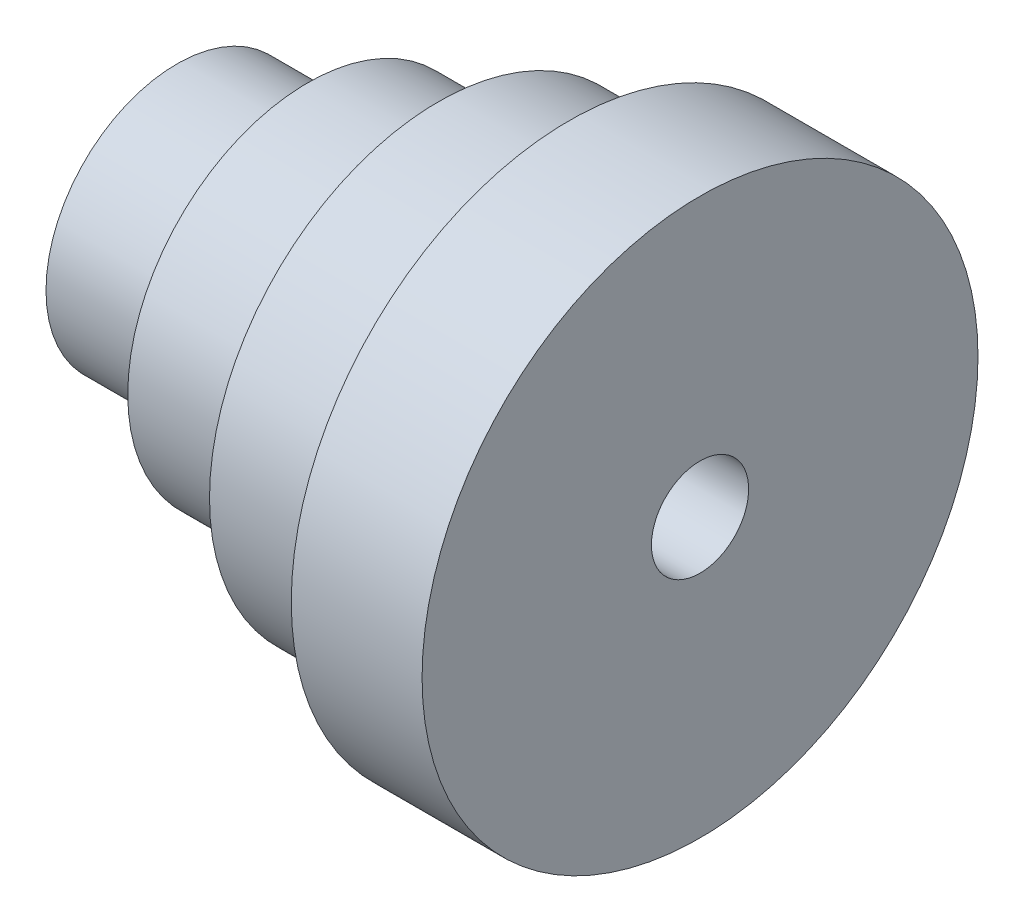
ISO-10303-21;
HEADER;
FILE_DESCRIPTION(('STEP AP214'),'2;1');
FILE_NAME('part.step','',(''),(''),'','','');
FILE_SCHEMA(('AUTOMOTIVE_DESIGN { 1 0 10303 214 1 1 1 1 }'));
ENDSEC;
DATA;
#1=APPLICATION_CONTEXT('core data for automotive mechanical design processes');
#2=APPLICATION_PROTOCOL_DEFINITION('international standard','automotive_design',2000,#1);
#3=PRODUCT_CONTEXT('',#1,'mechanical');
#4=PRODUCT('Part','Part','',(#3));
#5=PRODUCT_RELATED_PRODUCT_CATEGORY('part','',(#4));
#6=PRODUCT_DEFINITION_FORMATION('','',#4);
#7=PRODUCT_DEFINITION_CONTEXT('part definition',#1,'design');
#8=PRODUCT_DEFINITION('design','',#6,#7);
#9=PRODUCT_DEFINITION_SHAPE('','',#8);
#10=(LENGTH_UNIT() NAMED_UNIT(*) SI_UNIT(.MILLI.,.METRE.));
#11=(NAMED_UNIT(*) PLANE_ANGLE_UNIT() SI_UNIT($,.RADIAN.));
#12=(NAMED_UNIT(*) SI_UNIT($,.STERADIAN.) SOLID_ANGLE_UNIT());
#13=UNCERTAINTY_MEASURE_WITH_UNIT(LENGTH_MEASURE(1.E-05),#10,'distance_accuracy_value','');
#14=(GEOMETRIC_REPRESENTATION_CONTEXT(3) GLOBAL_UNCERTAINTY_ASSIGNED_CONTEXT((#13)) GLOBAL_UNIT_ASSIGNED_CONTEXT((#10,
#11,#12)) REPRESENTATION_CONTEXT('',''));
#15=CARTESIAN_POINT('',(0.,0.,0.));
#16=DIRECTION('',(0.,0.,1.));
#17=DIRECTION('',(1.,0.,0.));
#18=AXIS2_PLACEMENT_3D('',#15,#16,#17);
#19=CARTESIAN_POINT('',(-16.,0.,0.));
#20=DIRECTION('',(1.,0.,0.));
#21=DIRECTION('',(0.,0.,-1.));
#22=AXIS2_PLACEMENT_3D('',#19,#20,#21);
#23=PLANE('',#22);
#24=CARTESIAN_POINT('',(-16.,0.,0.));
#25=DIRECTION('',(-1.,0.,0.));
#26=DIRECTION('',(0.,0.,1.));
#27=AXIS2_PLACEMENT_3D('',#24,#25,#26);
#28=CIRCLE('',#27,14.8677131293198);
#29=CARTESIAN_POINT('',(-16.,0.,14.8677131293198));
#30=VERTEX_POINT('',#29);
#31=EDGE_CURVE('E97',#30,#30,#28,.T.);
#32=ORIENTED_EDGE('',*,*,#31,.T.);
#33=EDGE_LOOP('',(#32));
#34=FACE_BOUND('',#33,.T.);
#35=CARTESIAN_POINT('',(-16.,0.,0.));
#36=DIRECTION('',(-1.,0.,0.));
#37=DIRECTION('',(0.,0.,1.));
#38=AXIS2_PLACEMENT_3D('',#35,#36,#37);
#39=CIRCLE('',#38,85.);
#40=CARTESIAN_POINT('',(-16.,0.,85.));
#41=VERTEX_POINT('',#40);
#42=EDGE_CURVE('E125',#41,#41,#39,.T.);
#43=ORIENTED_EDGE('',*,*,#42,.F.);
#44=EDGE_LOOP('',(#43));
#45=FACE_BOUND('',#44,.T.);
#46=ADVANCED_FACE('F33',(#34,#45),#23,.T.);
#47=CARTESIAN_POINT('',(-176.,0.,0.));
#48=DIRECTION('',(-1.,0.,0.));
#49=DIRECTION('',(0.,0.,1.));
#50=AXIS2_PLACEMENT_3D('',#47,#48,#49);
#51=CYLINDRICAL_SURFACE('',#50,85.);
#52=ORIENTED_EDGE('',*,*,#42,.T.);
#53=EDGE_LOOP('',(#52));
#54=FACE_BOUND('',#53,.T.);
#55=CARTESIAN_POINT('',(-56.,0.,0.));
#56=DIRECTION('',(-1.,0.,0.));
#57=DIRECTION('',(0.,0.,1.));
#58=AXIS2_PLACEMENT_3D('',#55,#56,#57);
#59=CIRCLE('',#58,85.);
#60=CARTESIAN_POINT('',(-56.,0.,85.));
#61=VERTEX_POINT('',#60);
#62=EDGE_CURVE('E122',#61,#61,#59,.T.);
#63=ORIENTED_EDGE('',*,*,#62,.F.);
#64=EDGE_LOOP('',(#63));
#65=FACE_BOUND('',#64,.T.);
#66=ADVANCED_FACE('F147',(#54,#65),#51,.T.);
#67=CARTESIAN_POINT('',(-56.,0.,0.));
#68=DIRECTION('',(-1.,0.,0.));
#69=DIRECTION('',(0.,0.,1.));
#70=AXIS2_PLACEMENT_3D('',#67,#68,#69);
#71=PLANE('',#70);
#72=ORIENTED_EDGE('',*,*,#62,.T.);
#73=EDGE_LOOP('',(#72));
#74=FACE_BOUND('',#73,.T.);
#75=CARTESIAN_POINT('',(-56.,0.,0.));
#76=DIRECTION('',(-1.,0.,0.));
#77=DIRECTION('',(0.,0.,1.));
#78=AXIS2_PLACEMENT_3D('',#75,#76,#77);
#79=CIRCLE('',#78,70.);
#80=CARTESIAN_POINT('',(-56.,0.,70.));
#81=VERTEX_POINT('',#80);
#82=EDGE_CURVE('E119',#81,#81,#79,.T.);
#83=ORIENTED_EDGE('',*,*,#82,.F.);
#84=EDGE_LOOP('',(#83));
#85=FACE_BOUND('',#84,.T.);
#86=ADVANCED_FACE('F152',(#74,#85),#71,.T.);
#87=CARTESIAN_POINT('',(-176.,0.,0.));
#88=DIRECTION('',(-1.,0.,0.));
#89=DIRECTION('',(0.,0.,1.));
#90=AXIS2_PLACEMENT_3D('',#87,#88,#89);
#91=CYLINDRICAL_SURFACE('',#90,70.);
#92=ORIENTED_EDGE('',*,*,#82,.T.);
#93=EDGE_LOOP('',(#92));
#94=FACE_BOUND('',#93,.T.);
#95=CARTESIAN_POINT('',(-96.,0.,0.));
#96=DIRECTION('',(-1.,0.,0.));
#97=DIRECTION('',(0.,0.,1.));
#98=AXIS2_PLACEMENT_3D('',#95,#96,#97);
#99=CIRCLE('',#98,70.);
#100=CARTESIAN_POINT('',(-96.,0.,70.));
#101=VERTEX_POINT('',#100);
#102=EDGE_CURVE('E116',#101,#101,#99,.T.);
#103=ORIENTED_EDGE('',*,*,#102,.F.);
#104=EDGE_LOOP('',(#103));
#105=FACE_BOUND('',#104,.T.);
#106=ADVANCED_FACE('F162',(#94,#105),#91,.T.);
#107=CARTESIAN_POINT('',(-96.,0.,0.));
#108=DIRECTION('',(-1.,0.,0.));
#109=DIRECTION('',(0.,0.,1.));
#110=AXIS2_PLACEMENT_3D('',#107,#108,#109);
#111=PLANE('',#110);
#112=ORIENTED_EDGE('',*,*,#102,.T.);
#113=EDGE_LOOP('',(#112));
#114=FACE_BOUND('',#113,.T.);
#115=CARTESIAN_POINT('',(-96.,0.,0.));
#116=DIRECTION('',(-1.,0.,0.));
#117=DIRECTION('',(0.,0.,1.));
#118=AXIS2_PLACEMENT_3D('',#115,#116,#117);
#119=CIRCLE('',#118,55.);
#120=CARTESIAN_POINT('',(-96.,0.,55.));
#121=VERTEX_POINT('',#120);
#122=EDGE_CURVE('E113',#121,#121,#119,.T.);
#123=ORIENTED_EDGE('',*,*,#122,.F.);
#124=EDGE_LOOP('',(#123));
#125=FACE_BOUND('',#124,.T.);
#126=ADVANCED_FACE('F168',(#114,#125),#111,.T.);
#127=CARTESIAN_POINT('',(-176.,0.,0.));
#128=DIRECTION('',(-1.,0.,0.));
#129=DIRECTION('',(0.,0.,1.));
#130=AXIS2_PLACEMENT_3D('',#127,#128,#129);
#131=CYLINDRICAL_SURFACE('',#130,55.);
#132=ORIENTED_EDGE('',*,*,#122,.T.);
#133=EDGE_LOOP('',(#132));
#134=FACE_BOUND('',#133,.T.);
#135=CARTESIAN_POINT('',(-136.,0.,0.));
#136=DIRECTION('',(-1.,0.,0.));
#137=DIRECTION('',(0.,0.,1.));
#138=AXIS2_PLACEMENT_3D('',#135,#136,#137);
#139=CIRCLE('',#138,55.);
#140=CARTESIAN_POINT('',(-136.,0.,55.));
#141=VERTEX_POINT('',#140);
#142=EDGE_CURVE('E110',#141,#141,#139,.T.);
#143=ORIENTED_EDGE('',*,*,#142,.F.);
#144=EDGE_LOOP('',(#143));
#145=FACE_BOUND('',#144,.T.);
#146=ADVANCED_FACE('F174',(#134,#145),#131,.T.);
#147=CARTESIAN_POINT('',(-136.,0.,0.));
#148=DIRECTION('',(-1.,0.,0.));
#149=DIRECTION('',(0.,0.,1.));
#150=AXIS2_PLACEMENT_3D('',#147,#148,#149);
#151=PLANE('',#150);
#152=ORIENTED_EDGE('',*,*,#142,.T.);
#153=EDGE_LOOP('',(#152));
#154=FACE_BOUND('',#153,.T.);
#155=CARTESIAN_POINT('',(-136.,0.,0.));
#156=DIRECTION('',(-1.,0.,0.));
#157=DIRECTION('',(0.,0.,1.));
#158=AXIS2_PLACEMENT_3D('',#155,#156,#157);
#159=CIRCLE('',#158,40.);
#160=CARTESIAN_POINT('',(-136.,0.,40.));
#161=VERTEX_POINT('',#160);
#162=EDGE_CURVE('E107',#161,#161,#159,.T.);
#163=ORIENTED_EDGE('',*,*,#162,.F.);
#164=EDGE_LOOP('',(#163));
#165=FACE_BOUND('',#164,.T.);
#166=ADVANCED_FACE('F180',(#154,#165),#151,.T.);
#167=CARTESIAN_POINT('',(-176.,0.,0.));
#168=DIRECTION('',(-1.,0.,0.));
#169=DIRECTION('',(0.,0.,1.));
#170=AXIS2_PLACEMENT_3D('',#167,#168,#169);
#171=CYLINDRICAL_SURFACE('',#170,40.);
#172=ORIENTED_EDGE('',*,*,#162,.T.);
#173=EDGE_LOOP('',(#172));
#174=FACE_BOUND('',#173,.T.);
#175=CARTESIAN_POINT('',(-176.,0.,0.));
#176=DIRECTION('',(-1.,0.,0.));
#177=DIRECTION('',(0.,0.,1.));
#178=AXIS2_PLACEMENT_3D('',#175,#176,#177);
#179=CIRCLE('',#178,40.);
#180=CARTESIAN_POINT('',(-176.,0.,40.));
#181=VERTEX_POINT('',#180);
#182=EDGE_CURVE('E104',#181,#181,#179,.T.);
#183=ORIENTED_EDGE('',*,*,#182,.F.);
#184=EDGE_LOOP('',(#183));
#185=FACE_BOUND('',#184,.T.);
#186=ADVANCED_FACE('F186',(#174,#185),#171,.T.);
#187=CARTESIAN_POINT('',(-176.,0.,0.));
#188=DIRECTION('',(1.,0.,0.));
#189=DIRECTION('',(0.,0.,-1.));
#190=AXIS2_PLACEMENT_3D('',#187,#188,#189);
#191=PLANE('',#190);
#192=CARTESIAN_POINT('',(-176.,0.,0.));
#193=DIRECTION('',(-1.,0.,0.));
#194=DIRECTION('',(0.,0.,1.));
#195=AXIS2_PLACEMENT_3D('',#192,#193,#194);
#196=CIRCLE('',#195,14.8677131293198);
#197=CARTESIAN_POINT('',(-176.,-14.5618986981694,3.));
#198=VERTEX_POINT('',#197);
#199=CARTESIAN_POINT('',(-176.,-14.5618986981694,-3.));
#200=VERTEX_POINT('',#199);
#201=EDGE_CURVE('E101',#198,#200,#196,.T.);
#202=ORIENTED_EDGE('',*,*,#201,.F.);
#203=DIRECTION('',(0.,1.,0.));
#204=VECTOR('',#203,1.);
#205=CARTESIAN_POINT('',(-176.,-9.86771312931979,3.));
#206=LINE('',#205,#204);
#207=CARTESIAN_POINT('',(-176.,-19.8677131293198,3.));
#208=VERTEX_POINT('',#207);
#209=EDGE_CURVE('E92',#208,#198,#206,.T.);
#210=ORIENTED_EDGE('',*,*,#209,.F.);
#211=DIRECTION('',(0.,0.,1.));
#212=VECTOR('',#211,1.);
#213=CARTESIAN_POINT('',(-176.,-19.8677131293198,-3.));
#214=LINE('',#213,#212);
#215=CARTESIAN_POINT('',(-176.,-19.8677131293198,-3.));
#216=VERTEX_POINT('',#215);
#217=EDGE_CURVE('E95',#216,#208,#214,.T.);
#218=ORIENTED_EDGE('',*,*,#217,.F.);
#219=DIRECTION('',(0.,-1.,0.));
#220=VECTOR('',#219,1.);
#221=CARTESIAN_POINT('',(-176.,-9.86771312931979,-3.));
#222=LINE('',#221,#220);
#223=EDGE_CURVE('E82',#200,#216,#222,.T.);
#224=ORIENTED_EDGE('',*,*,#223,.F.);
#225=EDGE_LOOP('',(#202,#210,#218,#224));
#226=FACE_BOUND('',#225,.T.);
#227=ORIENTED_EDGE('',*,*,#182,.T.);
#228=EDGE_LOOP('',(#227));
#229=FACE_BOUND('',#228,.T.);
#230=ADVANCED_FACE('F132',(#226,#229),#191,.F.);
#231=CARTESIAN_POINT('',(-176.,0.,0.));
#232=DIRECTION('',(-1.,0.,0.));
#233=DIRECTION('',(0.,0.,1.));
#234=AXIS2_PLACEMENT_3D('',#231,#232,#233);
#235=CYLINDRICAL_SURFACE('',#234,14.8677131293198);
#236=ORIENTED_EDGE('',*,*,#31,.F.);
#237=EDGE_LOOP('',(#236));
#238=FACE_BOUND('',#237,.T.);
#239=CARTESIAN_POINT('',(-76.,0.,0.));
#240=DIRECTION('',(-1.,0.,0.));
#241=DIRECTION('',(0.,0.,1.));
#242=AXIS2_PLACEMENT_3D('',#239,#240,#241);
#243=CIRCLE('',#242,14.8677131293198);
#244=CARTESIAN_POINT('',(-76.,-14.5618986981694,3.));
#245=VERTEX_POINT('',#244);
#246=CARTESIAN_POINT('',(-76.,-14.5618986981694,-3.));
#247=VERTEX_POINT('',#246);
#248=EDGE_CURVE('E52',#245,#247,#243,.F.);
#249=ORIENTED_EDGE('',*,*,#248,.F.);
#250=DIRECTION('',(-1.,0.,0.));
#251=VECTOR('',#250,1.);
#252=CARTESIAN_POINT('',(-176.,-14.5618986981694,3.));
#253=LINE('',#252,#251);
#254=EDGE_CURVE('E11',#245,#198,#253,.T.);
#255=ORIENTED_EDGE('',*,*,#254,.T.);
#256=ORIENTED_EDGE('',*,*,#201,.T.);
#257=DIRECTION('',(-1.,0.,0.));
#258=VECTOR('',#257,1.);
#259=CARTESIAN_POINT('',(-176.,-14.5618986981694,-3.));
#260=LINE('',#259,#258);
#261=EDGE_CURVE('E40',#200,#247,#260,.F.);
#262=ORIENTED_EDGE('',*,*,#261,.T.);
#263=EDGE_LOOP('',(#249,#255,#256,#262));
#264=FACE_BOUND('',#263,.T.);
#265=ADVANCED_FACE('F129',(#238,#264),#235,.F.);
#266=CARTESIAN_POINT('',(-76.,-9.86771312931979,3.));
#267=DIRECTION('',(0.,0.,1.));
#268=DIRECTION('',(0.,-1.,0.));
#269=AXIS2_PLACEMENT_3D('',#266,#267,#268);
#270=PLANE('',#269);
#271=DIRECTION('',(0.,1.,0.));
#272=VECTOR('',#271,1.);
#273=CARTESIAN_POINT('',(-76.,-9.86771312931979,3.));
#274=LINE('',#273,#272);
#275=CARTESIAN_POINT('',(-76.,-19.8677131293198,3.));
#276=VERTEX_POINT('',#275);
#277=EDGE_CURVE('E47',#276,#245,#274,.T.);
#278=ORIENTED_EDGE('',*,*,#277,.F.);
#279=DIRECTION('',(-1.,0.,0.));
#280=VECTOR('',#279,1.);
#281=CARTESIAN_POINT('',(-76.,-19.8677131293198,3.));
#282=LINE('',#281,#280);
#283=EDGE_CURVE('E86',#276,#208,#282,.T.);
#284=ORIENTED_EDGE('',*,*,#283,.T.);
#285=ORIENTED_EDGE('',*,*,#209,.T.);
#286=ORIENTED_EDGE('',*,*,#254,.F.);
#287=EDGE_LOOP('',(#278,#284,#285,#286));
#288=FACE_BOUND('',#287,.T.);
#289=ADVANCED_FACE('F136',(#288),#270,.F.);
#290=CARTESIAN_POINT('',(-76.,-9.86771312931979,-3.));
#291=DIRECTION('',(0.,0.,-1.));
#292=DIRECTION('',(0.,1.,0.));
#293=AXIS2_PLACEMENT_3D('',#290,#291,#292);
#294=PLANE('',#293);
#295=ORIENTED_EDGE('',*,*,#223,.T.);
#296=DIRECTION('',(-1.,0.,0.));
#297=VECTOR('',#296,1.);
#298=CARTESIAN_POINT('',(-76.,-19.8677131293198,-3.));
#299=LINE('',#298,#297);
#300=CARTESIAN_POINT('',(-76.,-19.8677131293198,-3.));
#301=VERTEX_POINT('',#300);
#302=EDGE_CURVE('E79',#301,#216,#299,.T.);
#303=ORIENTED_EDGE('',*,*,#302,.F.);
#304=DIRECTION('',(0.,-1.,0.));
#305=VECTOR('',#304,1.);
#306=CARTESIAN_POINT('',(-76.,-9.86771312931979,-3.));
#307=LINE('',#306,#305);
#308=EDGE_CURVE('E70',#247,#301,#307,.T.);
#309=ORIENTED_EDGE('',*,*,#308,.F.);
#310=ORIENTED_EDGE('',*,*,#261,.F.);
#311=EDGE_LOOP('',(#295,#303,#309,#310));
#312=FACE_BOUND('',#311,.T.);
#313=ADVANCED_FACE('F80',(#312),#294,.F.);
#314=CARTESIAN_POINT('',(-76.,0.,0.));
#315=DIRECTION('',(-1.,0.,0.));
#316=DIRECTION('',(0.,0.,1.));
#317=AXIS2_PLACEMENT_3D('',#314,#315,#316);
#318=PLANE('',#317);
#319=ORIENTED_EDGE('',*,*,#248,.T.);
#320=ORIENTED_EDGE('',*,*,#308,.T.);
#321=DIRECTION('',(0.,0.,1.));
#322=VECTOR('',#321,1.);
#323=CARTESIAN_POINT('',(-76.,-19.8677131293198,-3.));
#324=LINE('',#323,#322);
#325=EDGE_CURVE('E74',#301,#276,#324,.T.);
#326=ORIENTED_EDGE('',*,*,#325,.T.);
#327=ORIENTED_EDGE('',*,*,#277,.T.);
#328=EDGE_LOOP('',(#319,#320,#326,#327));
#329=FACE_BOUND('',#328,.T.);
#330=ADVANCED_FACE('F72',(#329),#318,.T.);
#331=CARTESIAN_POINT('',(-76.,-19.8677131293198,-3.));
#332=DIRECTION('',(0.,-1.,0.));
#333=DIRECTION('',(0.,0.,-1.));
#334=AXIS2_PLACEMENT_3D('',#331,#332,#333);
#335=PLANE('',#334);
#336=ORIENTED_EDGE('',*,*,#217,.T.);
#337=ORIENTED_EDGE('',*,*,#283,.F.);
#338=ORIENTED_EDGE('',*,*,#325,.F.);
#339=ORIENTED_EDGE('',*,*,#302,.T.);
#340=EDGE_LOOP('',(#336,#337,#338,#339));
#341=FACE_BOUND('',#340,.T.);
#342=ADVANCED_FACE('F88',(#341),#335,.F.);
#343=CLOSED_SHELL('',(#46,#66,#86,#106,#126,#146,#166,#186,#230,#265,#289,#313,#330,#342));
#344=MANIFOLD_SOLID_BREP('B2',#343);
#345=ADVANCED_BREP_SHAPE_REPRESENTATION('',(#18,#344),#14);
#346=SHAPE_DEFINITION_REPRESENTATION(#9,#345);
ENDSEC;
END-ISO-10303-21;
